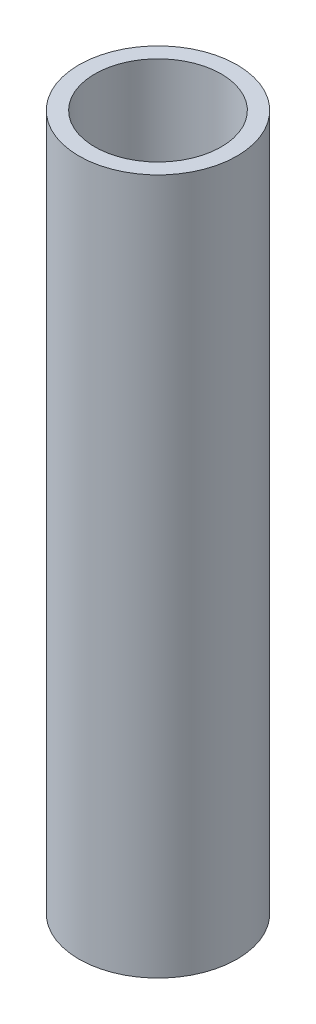
ISO-10303-21;
HEADER;
FILE_DESCRIPTION(('STEP AP214'),'2;1');
FILE_NAME('part.step','',(''),(''),'','','');
FILE_SCHEMA(('AUTOMOTIVE_DESIGN { 1 0 10303 214 1 1 1 1 }'));
ENDSEC;
DATA;
#1=APPLICATION_CONTEXT('core data for automotive mechanical design processes');
#2=APPLICATION_PROTOCOL_DEFINITION('international standard','automotive_design',2000,#1);
#3=PRODUCT_CONTEXT('',#1,'mechanical');
#4=PRODUCT('Part','Part','',(#3));
#5=PRODUCT_RELATED_PRODUCT_CATEGORY('part','',(#4));
#6=PRODUCT_DEFINITION_FORMATION('','',#4);
#7=PRODUCT_DEFINITION_CONTEXT('part definition',#1,'design');
#8=PRODUCT_DEFINITION('design','',#6,#7);
#9=PRODUCT_DEFINITION_SHAPE('','',#8);
#10=(LENGTH_UNIT() NAMED_UNIT(*) SI_UNIT(.MILLI.,.METRE.));
#11=(NAMED_UNIT(*) PLANE_ANGLE_UNIT() SI_UNIT($,.RADIAN.));
#12=(NAMED_UNIT(*) SI_UNIT($,.STERADIAN.) SOLID_ANGLE_UNIT());
#13=UNCERTAINTY_MEASURE_WITH_UNIT(LENGTH_MEASURE(1.E-05),#10,'distance_accuracy_value','');
#14=(GEOMETRIC_REPRESENTATION_CONTEXT(3) GLOBAL_UNCERTAINTY_ASSIGNED_CONTEXT((#13)) GLOBAL_UNIT_ASSIGNED_CONTEXT((#10,
#11,#12)) REPRESENTATION_CONTEXT('',''));
#15=CARTESIAN_POINT('',(0.,0.,0.));
#16=DIRECTION('',(0.,0.,1.));
#17=DIRECTION('',(1.,0.,0.));
#18=AXIS2_PLACEMENT_3D('',#15,#16,#17);
#19=CARTESIAN_POINT('',(0.,0.,0.));
#20=DIRECTION('',(0.,-1.,0.));
#21=DIRECTION('',(0.,0.,-1.));
#22=AXIS2_PLACEMENT_3D('',#19,#20,#21);
#23=PLANE('',#22);
#24=CARTESIAN_POINT('',(0.,0.,0.));
#25=DIRECTION('',(0.,-1.,0.));
#26=DIRECTION('',(0.,0.,-1.));
#27=AXIS2_PLACEMENT_3D('',#24,#25,#26);
#28=CIRCLE('',#27,7.5);
#29=CARTESIAN_POINT('',(0.,0.,-7.5));
#30=VERTEX_POINT('',#29);
#31=EDGE_CURVE('E10',#30,#30,#28,.T.);
#32=ORIENTED_EDGE('',*,*,#31,.T.);
#33=EDGE_LOOP('',(#32));
#34=FACE_BOUND('',#33,.T.);
#35=CARTESIAN_POINT('',(0.,0.,0.));
#36=DIRECTION('',(0.,-1.,0.));
#37=DIRECTION('',(0.,0.,-1.));
#38=AXIS2_PLACEMENT_3D('',#35,#36,#37);
#39=CIRCLE('',#38,6.);
#40=CARTESIAN_POINT('',(0.,0.,-6.));
#41=VERTEX_POINT('',#40);
#42=EDGE_CURVE('E53',#41,#41,#39,.T.);
#43=ORIENTED_EDGE('',*,*,#42,.F.);
#44=EDGE_LOOP('',(#43));
#45=FACE_BOUND('',#44,.T.);
#46=ADVANCED_FACE('F39',(#34,#45),#23,.T.);
#47=CARTESIAN_POINT('',(0.,0.,0.));
#48=DIRECTION('',(0.,-1.,0.));
#49=DIRECTION('',(0.,0.,-1.));
#50=AXIS2_PLACEMENT_3D('',#47,#48,#49);
#51=CYLINDRICAL_SURFACE('',#50,7.5);
#52=CARTESIAN_POINT('',(0.,66.,0.));
#53=DIRECTION('',(0.,-1.,0.));
#54=DIRECTION('',(0.,0.,-1.));
#55=AXIS2_PLACEMENT_3D('',#52,#53,#54);
#56=CIRCLE('',#55,7.5);
#57=CARTESIAN_POINT('',(0.,66.,-7.5));
#58=VERTEX_POINT('',#57);
#59=EDGE_CURVE('E45',#58,#58,#56,.T.);
#60=ORIENTED_EDGE('',*,*,#59,.T.);
#61=EDGE_LOOP('',(#60));
#62=FACE_BOUND('',#61,.T.);
#63=ORIENTED_EDGE('',*,*,#31,.F.);
#64=EDGE_LOOP('',(#63));
#65=FACE_BOUND('',#64,.T.);
#66=ADVANCED_FACE('F62',(#62,#65),#51,.T.);
#67=CARTESIAN_POINT('',(0.,66.,0.));
#68=DIRECTION('',(0.,-1.,0.));
#69=DIRECTION('',(0.,0.,-1.));
#70=AXIS2_PLACEMENT_3D('',#67,#68,#69);
#71=PLANE('',#70);
#72=ORIENTED_EDGE('',*,*,#59,.F.);
#73=EDGE_LOOP('',(#72));
#74=FACE_BOUND('',#73,.T.);
#75=CARTESIAN_POINT('',(0.,66.,0.));
#76=DIRECTION('',(0.,-1.,0.));
#77=DIRECTION('',(0.,0.,-1.));
#78=AXIS2_PLACEMENT_3D('',#75,#76,#77);
#79=CIRCLE('',#78,6.);
#80=CARTESIAN_POINT('',(0.,66.,-6.));
#81=VERTEX_POINT('',#80);
#82=EDGE_CURVE('E49',#81,#81,#79,.T.);
#83=ORIENTED_EDGE('',*,*,#82,.T.);
#84=EDGE_LOOP('',(#83));
#85=FACE_BOUND('',#84,.T.);
#86=ADVANCED_FACE('F66',(#74,#85),#71,.F.);
#87=CARTESIAN_POINT('',(0.,0.,0.));
#88=DIRECTION('',(0.,-1.,0.));
#89=DIRECTION('',(0.,0.,-1.));
#90=AXIS2_PLACEMENT_3D('',#87,#88,#89);
#91=CYLINDRICAL_SURFACE('',#90,6.);
#92=ORIENTED_EDGE('',*,*,#82,.F.);
#93=EDGE_LOOP('',(#92));
#94=FACE_BOUND('',#93,.T.);
#95=ORIENTED_EDGE('',*,*,#42,.T.);
#96=EDGE_LOOP('',(#95));
#97=FACE_BOUND('',#96,.T.);
#98=ADVANCED_FACE('F59',(#94,#97),#91,.F.);
#99=CLOSED_SHELL('',(#46,#66,#86,#98));
#100=MANIFOLD_SOLID_BREP('B2',#99);
#101=ADVANCED_BREP_SHAPE_REPRESENTATION('',(#18,#100),#14);
#102=SHAPE_DEFINITION_REPRESENTATION(#9,#101);
ENDSEC;
END-ISO-10303-21;
